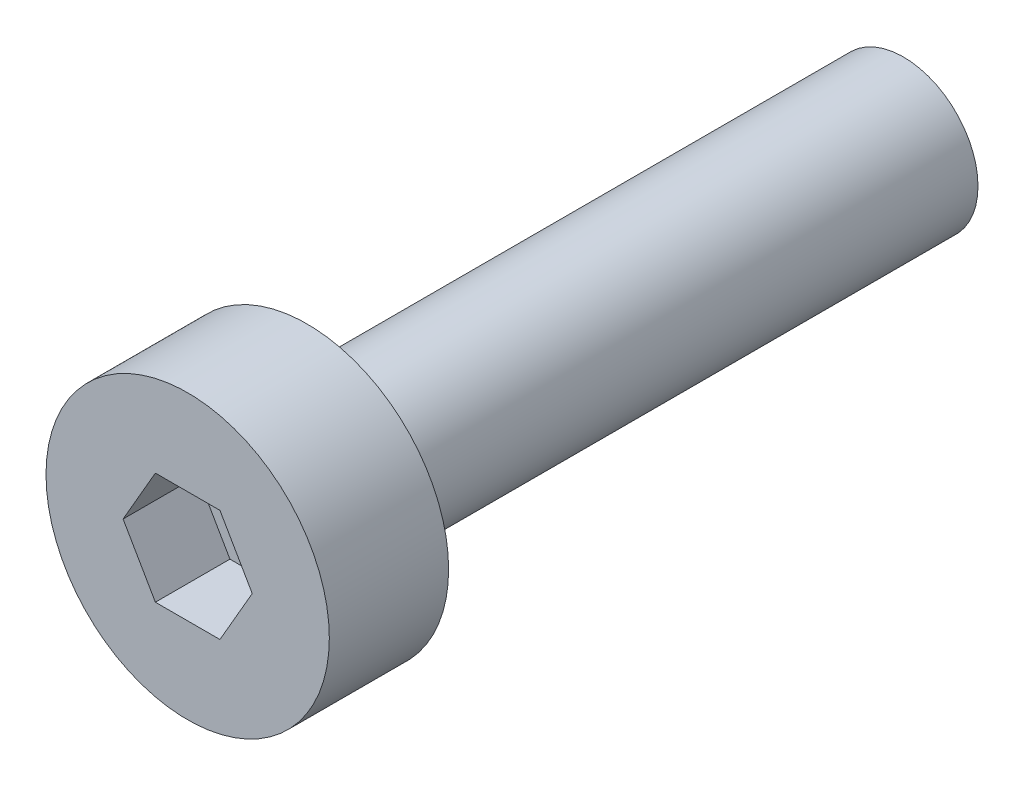
ISO-10303-21;
HEADER;
FILE_DESCRIPTION(('STEP AP214'),'2;1');
FILE_NAME('part.step','',(''),(''),'','','');
FILE_SCHEMA(('AUTOMOTIVE_DESIGN { 1 0 10303 214 1 1 1 1 }'));
ENDSEC;
DATA;
#1=APPLICATION_CONTEXT('core data for automotive mechanical design processes');
#2=APPLICATION_PROTOCOL_DEFINITION('international standard','automotive_design',2000,#1);
#3=PRODUCT_CONTEXT('',#1,'mechanical');
#4=PRODUCT('Part','Part','',(#3));
#5=PRODUCT_RELATED_PRODUCT_CATEGORY('part','',(#4));
#6=PRODUCT_DEFINITION_FORMATION('','',#4);
#7=PRODUCT_DEFINITION_CONTEXT('part definition',#1,'design');
#8=PRODUCT_DEFINITION('design','',#6,#7);
#9=PRODUCT_DEFINITION_SHAPE('','',#8);
#10=(LENGTH_UNIT() NAMED_UNIT(*) SI_UNIT(.MILLI.,.METRE.));
#11=(NAMED_UNIT(*) PLANE_ANGLE_UNIT() SI_UNIT($,.RADIAN.));
#12=(NAMED_UNIT(*) SI_UNIT($,.STERADIAN.) SOLID_ANGLE_UNIT());
#13=UNCERTAINTY_MEASURE_WITH_UNIT(LENGTH_MEASURE(1.E-05),#10,'distance_accuracy_value','');
#14=(GEOMETRIC_REPRESENTATION_CONTEXT(3) GLOBAL_UNCERTAINTY_ASSIGNED_CONTEXT((#13)) GLOBAL_UNIT_ASSIGNED_CONTEXT((#10,
#11,#12)) REPRESENTATION_CONTEXT('',''));
#15=CARTESIAN_POINT('',(0.,0.,0.));
#16=DIRECTION('',(0.,0.,1.));
#17=DIRECTION('',(1.,0.,0.));
#18=AXIS2_PLACEMENT_3D('',#15,#16,#17);
#19=CARTESIAN_POINT('',(0.,0.,8.));
#20=DIRECTION('',(0.,0.,-1.));
#21=DIRECTION('',(-1.,0.,0.));
#22=AXIS2_PLACEMENT_3D('',#19,#20,#21);
#23=CYLINDRICAL_SURFACE('',#22,1.);
#24=CARTESIAN_POINT('',(0.,0.,8.));
#25=DIRECTION('',(0.,0.,1.));
#26=DIRECTION('',(1.,0.,0.));
#27=AXIS2_PLACEMENT_3D('',#24,#25,#26);
#28=CIRCLE('',#27,1.);
#29=CARTESIAN_POINT('',(1.,0.,8.));
#30=VERTEX_POINT('',#29);
#31=EDGE_CURVE('E11',#30,#30,#28,.T.);
#32=ORIENTED_EDGE('',*,*,#31,.F.);
#33=EDGE_LOOP('',(#32));
#34=FACE_BOUND('',#33,.T.);
#35=CARTESIAN_POINT('',(0.,0.,0.));
#36=DIRECTION('',(0.,0.,1.));
#37=DIRECTION('',(1.,0.,0.));
#38=AXIS2_PLACEMENT_3D('',#35,#36,#37);
#39=CIRCLE('',#38,1.);
#40=CARTESIAN_POINT('',(1.,0.,0.));
#41=VERTEX_POINT('',#40);
#42=EDGE_CURVE('E42',#41,#41,#39,.T.);
#43=ORIENTED_EDGE('',*,*,#42,.T.);
#44=EDGE_LOOP('',(#43));
#45=FACE_BOUND('',#44,.T.);
#46=ADVANCED_FACE('F39',(#34,#45),#23,.T.);
#47=CARTESIAN_POINT('',(0.,0.,0.));
#48=DIRECTION('',(0.,0.,1.));
#49=DIRECTION('',(1.,0.,0.));
#50=AXIS2_PLACEMENT_3D('',#47,#48,#49);
#51=PLANE('',#50);
#52=ORIENTED_EDGE('',*,*,#42,.F.);
#53=EDGE_LOOP('',(#52));
#54=FACE_BOUND('',#53,.T.);
#55=ADVANCED_FACE('F189',(#54),#51,.F.);
#56=CARTESIAN_POINT('',(0.,0.,9.6));
#57=DIRECTION('',(0.,0.,-1.));
#58=DIRECTION('',(-1.,0.,0.));
#59=AXIS2_PLACEMENT_3D('',#56,#57,#58);
#60=CYLINDRICAL_SURFACE('',#59,1.9);
#61=CARTESIAN_POINT('',(0.,0.,9.6));
#62=DIRECTION('',(0.,0.,1.));
#63=DIRECTION('',(1.,0.,0.));
#64=AXIS2_PLACEMENT_3D('',#61,#62,#63);
#65=CIRCLE('',#64,1.9);
#66=CARTESIAN_POINT('',(1.9,0.,9.6));
#67=VERTEX_POINT('',#66);
#68=EDGE_CURVE('E163',#67,#67,#65,.T.);
#69=ORIENTED_EDGE('',*,*,#68,.F.);
#70=EDGE_LOOP('',(#69));
#71=FACE_BOUND('',#70,.T.);
#72=CARTESIAN_POINT('',(0.,0.,8.));
#73=DIRECTION('',(0.,0.,1.));
#74=DIRECTION('',(1.,0.,0.));
#75=AXIS2_PLACEMENT_3D('',#72,#73,#74);
#76=CIRCLE('',#75,1.9);
#77=CARTESIAN_POINT('',(1.9,0.,8.));
#78=VERTEX_POINT('',#77);
#79=EDGE_CURVE('E153',#78,#78,#76,.T.);
#80=ORIENTED_EDGE('',*,*,#79,.T.);
#81=EDGE_LOOP('',(#80));
#82=FACE_BOUND('',#81,.T.);
#83=ADVANCED_FACE('F171',(#71,#82),#60,.T.);
#84=CARTESIAN_POINT('',(0.,0.,9.6));
#85=DIRECTION('',(0.,0.,1.));
#86=DIRECTION('',(1.,0.,0.));
#87=AXIS2_PLACEMENT_3D('',#84,#85,#86);
#88=PLANE('',#87);
#89=DIRECTION('',(0.499999999999999,0.866025403784439,0.));
#90=VECTOR('',#89,1.);
#91=CARTESIAN_POINT('',(0.433012701892219,-0.750000000000001,9.6));
#92=LINE('',#91,#90);
#93=CARTESIAN_POINT('',(0.433012701892219,-0.750000000000001,9.6));
#94=VERTEX_POINT('',#93);
#95=CARTESIAN_POINT('',(0.866025403784439,0.,9.6));
#96=VERTEX_POINT('',#95);
#97=EDGE_CURVE('E54',#94,#96,#92,.T.);
#98=ORIENTED_EDGE('',*,*,#97,.F.);
#99=DIRECTION('',(1.,0.,0.));
#100=VECTOR('',#99,1.);
#101=CARTESIAN_POINT('',(-0.43301270189222,-0.750000000000001,9.6));
#102=LINE('',#101,#100);
#103=CARTESIAN_POINT('',(-0.43301270189222,-0.750000000000001,9.6));
#104=VERTEX_POINT('',#103);
#105=EDGE_CURVE('E147',#104,#94,#102,.T.);
#106=ORIENTED_EDGE('',*,*,#105,.F.);
#107=DIRECTION('',(0.5,-0.866025403784439,0.));
#108=VECTOR('',#107,1.);
#109=CARTESIAN_POINT('',(-0.866025403784439,0.,9.6));
#110=LINE('',#109,#108);
#111=CARTESIAN_POINT('',(-0.866025403784439,0.,9.6));
#112=VERTEX_POINT('',#111);
#113=EDGE_CURVE('E144',#112,#104,#110,.T.);
#114=ORIENTED_EDGE('',*,*,#113,.F.);
#115=DIRECTION('',(-0.5,-0.866025403784439,0.));
#116=VECTOR('',#115,1.);
#117=CARTESIAN_POINT('',(-0.43301270189222,0.750000000000001,9.6));
#118=LINE('',#117,#116);
#119=CARTESIAN_POINT('',(-0.43301270189222,0.750000000000001,9.6));
#120=VERTEX_POINT('',#119);
#121=EDGE_CURVE('E102',#120,#112,#118,.T.);
#122=ORIENTED_EDGE('',*,*,#121,.F.);
#123=DIRECTION('',(-1.,0.,0.));
#124=VECTOR('',#123,1.);
#125=CARTESIAN_POINT('',(0.433012701892219,0.750000000000001,9.6));
#126=LINE('',#125,#124);
#127=CARTESIAN_POINT('',(0.433012701892219,0.750000000000001,9.6));
#128=VERTEX_POINT('',#127);
#129=EDGE_CURVE('E138',#128,#120,#126,.T.);
#130=ORIENTED_EDGE('',*,*,#129,.F.);
#131=DIRECTION('',(-0.5,0.866025403784438,0.));
#132=VECTOR('',#131,1.);
#133=CARTESIAN_POINT('',(0.866025403784439,0.,9.6));
#134=LINE('',#133,#132);
#135=EDGE_CURVE('E134',#96,#128,#134,.T.);
#136=ORIENTED_EDGE('',*,*,#135,.F.);
#137=EDGE_LOOP('',(#98,#106,#114,#122,#130,#136));
#138=FACE_BOUND('',#137,.T.);
#139=ORIENTED_EDGE('',*,*,#68,.T.);
#140=EDGE_LOOP('',(#139));
#141=FACE_BOUND('',#140,.T.);
#142=ADVANCED_FACE('F176',(#138,#141),#88,.T.);
#143=CARTESIAN_POINT('',(0.,0.,8.));
#144=DIRECTION('',(0.,0.,1.));
#145=DIRECTION('',(1.,0.,0.));
#146=AXIS2_PLACEMENT_3D('',#143,#144,#145);
#147=PLANE('',#146);
#148=ORIENTED_EDGE('',*,*,#31,.T.);
#149=EDGE_LOOP('',(#148));
#150=FACE_BOUND('',#149,.T.);
#151=ORIENTED_EDGE('',*,*,#79,.F.);
#152=EDGE_LOOP('',(#151));
#153=FACE_BOUND('',#152,.T.);
#154=ADVANCED_FACE('F173',(#150,#153),#147,.F.);
#155=CARTESIAN_POINT('',(0.433012701892219,-0.750000000000001,8.6));
#156=DIRECTION('',(0.866025403784439,-0.5,0.));
#157=DIRECTION('',(0.499999999999999,0.866025403784439,0.));
#158=AXIS2_PLACEMENT_3D('',#155,#156,#157);
#159=PLANE('',#158);
#160=ORIENTED_EDGE('',*,*,#97,.T.);
#161=DIRECTION('',(0.,0.,1.));
#162=VECTOR('',#161,1.);
#163=CARTESIAN_POINT('',(0.866025403784439,0.,8.6));
#164=LINE('',#163,#162);
#165=CARTESIAN_POINT('',(0.866025403784439,0.,8.6));
#166=VERTEX_POINT('',#165);
#167=EDGE_CURVE('E84',#166,#96,#164,.T.);
#168=ORIENTED_EDGE('',*,*,#167,.F.);
#169=DIRECTION('',(0.499999999999999,0.866025403784439,0.));
#170=VECTOR('',#169,1.);
#171=CARTESIAN_POINT('',(0.433012701892219,-0.750000000000001,8.6));
#172=LINE('',#171,#170);
#173=CARTESIAN_POINT('',(0.433012701892219,-0.750000000000001,8.6));
#174=VERTEX_POINT('',#173);
#175=EDGE_CURVE('E150',#174,#166,#172,.T.);
#176=ORIENTED_EDGE('',*,*,#175,.F.);
#177=DIRECTION('',(0.,0.,1.));
#178=VECTOR('',#177,1.);
#179=CARTESIAN_POINT('',(0.433012701892219,-0.750000000000001,8.6));
#180=LINE('',#179,#178);
#181=EDGE_CURVE('E62',#174,#94,#180,.T.);
#182=ORIENTED_EDGE('',*,*,#181,.T.);
#183=EDGE_LOOP('',(#160,#168,#176,#182));
#184=FACE_BOUND('',#183,.T.);
#185=ADVANCED_FACE('F175',(#184),#159,.F.);
#186=CARTESIAN_POINT('',(-0.43301270189222,-0.750000000000001,8.6));
#187=DIRECTION('',(0.,-1.,0.));
#188=DIRECTION('',(1.,0.,0.));
#189=AXIS2_PLACEMENT_3D('',#186,#187,#188);
#190=PLANE('',#189);
#191=ORIENTED_EDGE('',*,*,#105,.T.);
#192=ORIENTED_EDGE('',*,*,#181,.F.);
#193=DIRECTION('',(1.,0.,0.));
#194=VECTOR('',#193,1.);
#195=CARTESIAN_POINT('',(-0.43301270189222,-0.750000000000001,8.6));
#196=LINE('',#195,#194);
#197=CARTESIAN_POINT('',(-0.43301270189222,-0.750000000000001,8.6));
#198=VERTEX_POINT('',#197);
#199=EDGE_CURVE('E116',#198,#174,#196,.T.);
#200=ORIENTED_EDGE('',*,*,#199,.F.);
#201=DIRECTION('',(0.,0.,1.));
#202=VECTOR('',#201,1.);
#203=CARTESIAN_POINT('',(-0.43301270189222,-0.750000000000001,8.6));
#204=LINE('',#203,#202);
#205=EDGE_CURVE('E107',#198,#104,#204,.T.);
#206=ORIENTED_EDGE('',*,*,#205,.T.);
#207=EDGE_LOOP('',(#191,#192,#200,#206));
#208=FACE_BOUND('',#207,.T.);
#209=ADVANCED_FACE('F183',(#208),#190,.F.);
#210=CARTESIAN_POINT('',(-0.866025403784439,0.,8.6));
#211=DIRECTION('',(-0.866025403784439,-0.5,0.));
#212=DIRECTION('',(0.5,-0.866025403784439,0.));
#213=AXIS2_PLACEMENT_3D('',#210,#211,#212);
#214=PLANE('',#213);
#215=ORIENTED_EDGE('',*,*,#113,.T.);
#216=ORIENTED_EDGE('',*,*,#205,.F.);
#217=DIRECTION('',(0.5,-0.866025403784439,0.));
#218=VECTOR('',#217,1.);
#219=CARTESIAN_POINT('',(-0.866025403784439,0.,8.6));
#220=LINE('',#219,#218);
#221=CARTESIAN_POINT('',(-0.866025403784439,0.,8.6));
#222=VERTEX_POINT('',#221);
#223=EDGE_CURVE('E111',#222,#198,#220,.T.);
#224=ORIENTED_EDGE('',*,*,#223,.F.);
#225=DIRECTION('',(0.,0.,1.));
#226=VECTOR('',#225,1.);
#227=CARTESIAN_POINT('',(-0.866025403784439,0.,8.6));
#228=LINE('',#227,#226);
#229=EDGE_CURVE('E95',#222,#112,#228,.T.);
#230=ORIENTED_EDGE('',*,*,#229,.T.);
#231=EDGE_LOOP('',(#215,#216,#224,#230));
#232=FACE_BOUND('',#231,.T.);
#233=ADVANCED_FACE('F112',(#232),#214,.F.);
#234=CARTESIAN_POINT('',(-0.43301270189222,0.750000000000001,8.6));
#235=DIRECTION('',(-0.866025403784439,0.5,0.));
#236=DIRECTION('',(-0.5,-0.866025403784439,0.));
#237=AXIS2_PLACEMENT_3D('',#234,#235,#236);
#238=PLANE('',#237);
#239=ORIENTED_EDGE('',*,*,#121,.T.);
#240=ORIENTED_EDGE('',*,*,#229,.F.);
#241=DIRECTION('',(-0.5,-0.866025403784439,0.));
#242=VECTOR('',#241,1.);
#243=CARTESIAN_POINT('',(-0.43301270189222,0.750000000000001,8.6));
#244=LINE('',#243,#242);
#245=CARTESIAN_POINT('',(-0.43301270189222,0.750000000000001,8.6));
#246=VERTEX_POINT('',#245);
#247=EDGE_CURVE('E99',#246,#222,#244,.T.);
#248=ORIENTED_EDGE('',*,*,#247,.F.);
#249=DIRECTION('',(0.,0.,1.));
#250=VECTOR('',#249,1.);
#251=CARTESIAN_POINT('',(-0.43301270189222,0.750000000000001,8.6));
#252=LINE('',#251,#250);
#253=EDGE_CURVE('E108',#246,#120,#252,.T.);
#254=ORIENTED_EDGE('',*,*,#253,.T.);
#255=EDGE_LOOP('',(#239,#240,#248,#254));
#256=FACE_BOUND('',#255,.T.);
#257=ADVANCED_FACE('F97',(#256),#238,.F.);
#258=CARTESIAN_POINT('',(0.433012701892219,0.750000000000001,8.6));
#259=DIRECTION('',(0.,1.,0.));
#260=DIRECTION('',(0.,0.,1.));
#261=AXIS2_PLACEMENT_3D('',#258,#259,#260);
#262=PLANE('',#261);
#263=ORIENTED_EDGE('',*,*,#129,.T.);
#264=ORIENTED_EDGE('',*,*,#253,.F.);
#265=DIRECTION('',(-1.,0.,0.));
#266=VECTOR('',#265,1.);
#267=CARTESIAN_POINT('',(0.433012701892219,0.750000000000001,8.6));
#268=LINE('',#267,#266);
#269=CARTESIAN_POINT('',(0.433012701892219,0.750000000000001,8.6));
#270=VERTEX_POINT('',#269);
#271=EDGE_CURVE('E122',#270,#246,#268,.T.);
#272=ORIENTED_EDGE('',*,*,#271,.F.);
#273=DIRECTION('',(0.,0.,1.));
#274=VECTOR('',#273,1.);
#275=CARTESIAN_POINT('',(0.433012701892219,0.750000000000001,8.6));
#276=LINE('',#275,#274);
#277=EDGE_CURVE('E158',#270,#128,#276,.T.);
#278=ORIENTED_EDGE('',*,*,#277,.T.);
#279=EDGE_LOOP('',(#263,#264,#272,#278));
#280=FACE_BOUND('',#279,.T.);
#281=ADVANCED_FACE('F245',(#280),#262,.F.);
#282=CARTESIAN_POINT('',(0.866025403784439,0.,8.6));
#283=DIRECTION('',(0.866025403784438,0.5,0.));
#284=DIRECTION('',(-0.5,0.866025403784439,0.));
#285=AXIS2_PLACEMENT_3D('',#282,#283,#284);
#286=PLANE('',#285);
#287=ORIENTED_EDGE('',*,*,#135,.T.);
#288=ORIENTED_EDGE('',*,*,#277,.F.);
#289=DIRECTION('',(-0.5,0.866025403784438,0.));
#290=VECTOR('',#289,1.);
#291=CARTESIAN_POINT('',(0.866025403784439,0.,8.6));
#292=LINE('',#291,#290);
#293=EDGE_CURVE('E126',#166,#270,#292,.T.);
#294=ORIENTED_EDGE('',*,*,#293,.F.);
#295=ORIENTED_EDGE('',*,*,#167,.T.);
#296=EDGE_LOOP('',(#287,#288,#294,#295));
#297=FACE_BOUND('',#296,.T.);
#298=ADVANCED_FACE('F254',(#297),#286,.F.);
#299=CARTESIAN_POINT('',(0.,0.,8.6));
#300=DIRECTION('',(0.,0.,1.));
#301=DIRECTION('',(1.,0.,0.));
#302=AXIS2_PLACEMENT_3D('',#299,#300,#301);
#303=PLANE('',#302);
#304=ORIENTED_EDGE('',*,*,#175,.T.);
#305=ORIENTED_EDGE('',*,*,#293,.T.);
#306=ORIENTED_EDGE('',*,*,#271,.T.);
#307=ORIENTED_EDGE('',*,*,#247,.T.);
#308=ORIENTED_EDGE('',*,*,#223,.T.);
#309=ORIENTED_EDGE('',*,*,#199,.T.);
#310=EDGE_LOOP('',(#304,#305,#306,#307,#308,#309));
#311=FACE_BOUND('',#310,.T.);
#312=ADVANCED_FACE('F119',(#311),#303,.T.);
#313=CLOSED_SHELL('',(#46,#55,#83,#142,#154,#185,#209,#233,#257,#281,#298,#312));
#314=MANIFOLD_SOLID_BREP('B2',#313);
#315=ADVANCED_BREP_SHAPE_REPRESENTATION('',(#18,#314),#14);
#316=SHAPE_DEFINITION_REPRESENTATION(#9,#315);
ENDSEC;
END-ISO-10303-21;
